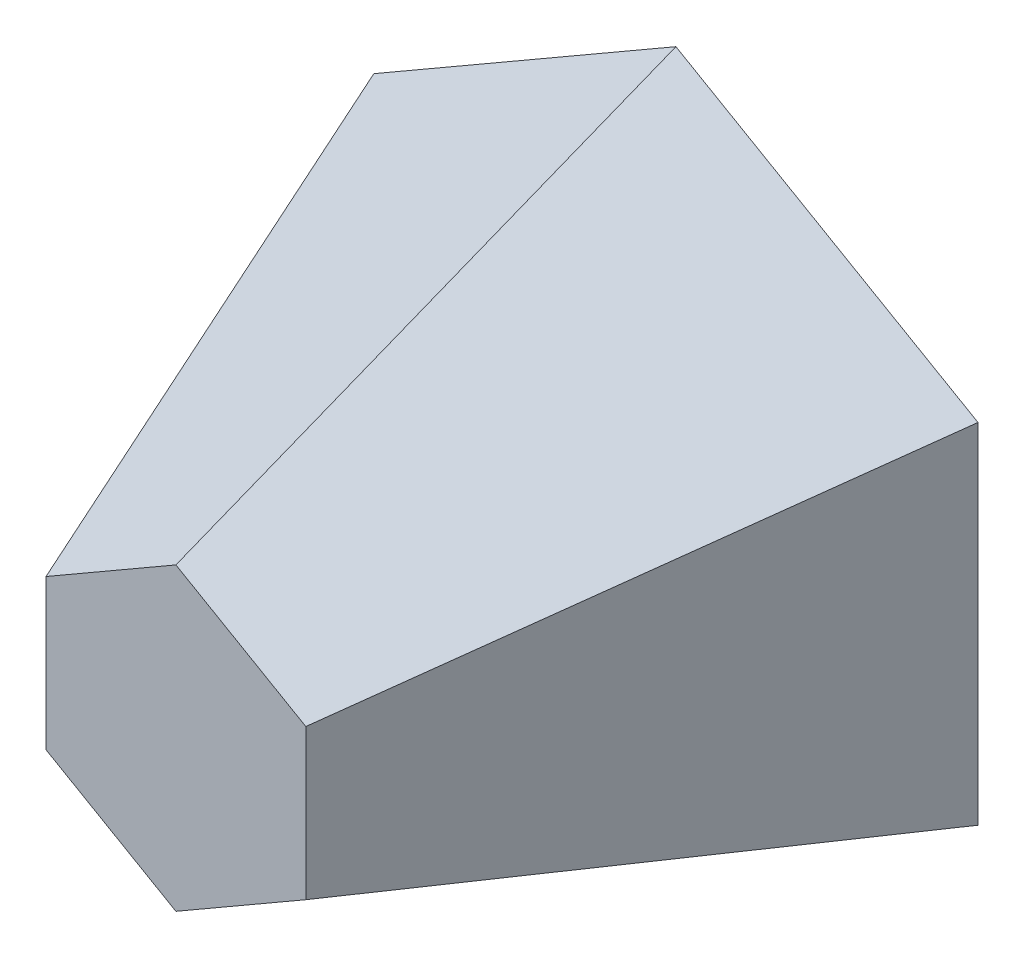
ISO-10303-21;
HEADER;
FILE_DESCRIPTION(('STEP AP214'),'2;1');
FILE_NAME('part.step','',(''),(''),'','','');
FILE_SCHEMA(('AUTOMOTIVE_DESIGN { 1 0 10303 214 1 1 1 1 }'));
ENDSEC;
DATA;
#1=APPLICATION_CONTEXT('core data for automotive mechanical design processes');
#2=APPLICATION_PROTOCOL_DEFINITION('international standard','automotive_design',2000,#1);
#3=PRODUCT_CONTEXT('',#1,'mechanical');
#4=PRODUCT('Part','Part','',(#3));
#5=PRODUCT_RELATED_PRODUCT_CATEGORY('part','',(#4));
#6=PRODUCT_DEFINITION_FORMATION('','',#4);
#7=PRODUCT_DEFINITION_CONTEXT('part definition',#1,'design');
#8=PRODUCT_DEFINITION('design','',#6,#7);
#9=PRODUCT_DEFINITION_SHAPE('','',#8);
#10=(LENGTH_UNIT() NAMED_UNIT(*) SI_UNIT(.MILLI.,.METRE.));
#11=(NAMED_UNIT(*) PLANE_ANGLE_UNIT() SI_UNIT($,.RADIAN.));
#12=(NAMED_UNIT(*) SI_UNIT($,.STERADIAN.) SOLID_ANGLE_UNIT());
#13=UNCERTAINTY_MEASURE_WITH_UNIT(LENGTH_MEASURE(1.E-05),#10,'distance_accuracy_value','');
#14=(GEOMETRIC_REPRESENTATION_CONTEXT(3) GLOBAL_UNCERTAINTY_ASSIGNED_CONTEXT((#13)) GLOBAL_UNIT_ASSIGNED_CONTEXT((#10,
#11,#12)) REPRESENTATION_CONTEXT('',''));
#15=CARTESIAN_POINT('',(0.,0.,0.));
#16=DIRECTION('',(0.,0.,1.));
#17=DIRECTION('',(1.,0.,0.));
#18=AXIS2_PLACEMENT_3D('',#15,#16,#17);
#19=CARTESIAN_POINT('',(64.9519052838329,37.5000000000001,125.));
#20=DIRECTION('',(0.472759287799658,0.818843106219086,0.325568154457157));
#21=DIRECTION('',(-0.866025403784439,0.5,0.));
#22=AXIS2_PLACEMENT_3D('',#19,#20,#21);
#23=PLANE('',#22);
#24=DIRECTION('',(0.866025403784439,-0.5,0.));
#25=VECTOR('',#24,1.);
#26=CARTESIAN_POINT('',(107.992856945041,112.049115083329,-125.));
#27=LINE('',#26,#25);
#28=CARTESIAN_POINT('',(151.033808606249,87.1994100555526,-125.));
#29=VERTEX_POINT('',#28);
#30=CARTESIAN_POINT('',(0.,174.398820111105,-125.));
#31=VERTEX_POINT('',#30);
#32=EDGE_CURVE('E98',#29,#31,#27,.F.);
#33=ORIENTED_EDGE('',*,*,#32,.T.);
#34=DIRECTION('',(0.,0.369463519951551,-0.929245235352331));
#35=VECTOR('',#34,1.);
#36=CARTESIAN_POINT('',(0.,75.,125.));
#37=LINE('',#36,#35);
#38=CARTESIAN_POINT('',(0.,75.,125.));
#39=VERTEX_POINT('',#38);
#40=EDGE_CURVE('E11',#39,#31,#37,.T.);
#41=ORIENTED_EDGE('',*,*,#40,.F.);
#42=DIRECTION('',(-0.866025403784439,0.5,0.));
#43=VECTOR('',#42,1.);
#44=CARTESIAN_POINT('',(64.9519052838329,37.5000000000001,125.));
#45=LINE('',#44,#43);
#46=CARTESIAN_POINT('',(64.9519052838329,37.5000000000001,125.));
#47=VERTEX_POINT('',#46);
#48=EDGE_CURVE('E120',#47,#39,#45,.T.);
#49=ORIENTED_EDGE('',*,*,#48,.F.);
#50=DIRECTION('',(0.319964794049662,0.184731759975776,-0.929245235352331));
#51=VECTOR('',#50,1.);
#52=CARTESIAN_POINT('',(64.9519052838329,37.5000000000001,125.));
#53=LINE('',#52,#51);
#54=EDGE_CURVE('E123',#47,#29,#53,.T.);
#55=ORIENTED_EDGE('',*,*,#54,.T.);
#56=EDGE_LOOP('',(#33,#41,#49,#55));
#57=FACE_BOUND('',#56,.T.);
#58=ADVANCED_FACE('F35',(#57),#23,.T.);
#59=CARTESIAN_POINT('',(0.,75.,125.));
#60=DIRECTION('',(-0.472759287799658,0.818843106219085,0.325568154457157));
#61=DIRECTION('',(-0.866025403784439,-0.5,0.));
#62=AXIS2_PLACEMENT_3D('',#59,#60,#61);
#63=PLANE('',#62);
#64=DIRECTION('',(0.866025403784439,0.5,0.));
#65=VECTOR('',#64,1.);
#66=CARTESIAN_POINT('',(-43.0409516612083,149.549115083329,-125.));
#67=LINE('',#66,#65);
#68=CARTESIAN_POINT('',(-151.033808606249,87.1994100555525,-125.));
#69=VERTEX_POINT('',#68);
#70=EDGE_CURVE('E87',#31,#69,#67,.F.);
#71=ORIENTED_EDGE('',*,*,#70,.T.);
#72=DIRECTION('',(-0.319964794049662,0.184731759975776,-0.929245235352331));
#73=VECTOR('',#72,1.);
#74=CARTESIAN_POINT('',(-64.9519052838329,37.5,125.));
#75=LINE('',#74,#73);
#76=CARTESIAN_POINT('',(-64.9519052838329,37.5,125.));
#77=VERTEX_POINT('',#76);
#78=EDGE_CURVE('E44',#77,#69,#75,.T.);
#79=ORIENTED_EDGE('',*,*,#78,.F.);
#80=DIRECTION('',(-0.866025403784438,-0.5,0.));
#81=VECTOR('',#80,1.);
#82=CARTESIAN_POINT('',(0.,75.,125.));
#83=LINE('',#82,#81);
#84=EDGE_CURVE('E139',#39,#77,#83,.T.);
#85=ORIENTED_EDGE('',*,*,#84,.F.);
#86=ORIENTED_EDGE('',*,*,#40,.T.);
#87=EDGE_LOOP('',(#71,#79,#85,#86));
#88=FACE_BOUND('',#87,.T.);
#89=ADVANCED_FACE('F89',(#88),#63,.T.);
#90=CARTESIAN_POINT('',(-64.9519052838329,37.5,125.));
#91=DIRECTION('',(-0.945518575599317,0.,0.325568154457157));
#92=DIRECTION('',(0.325568154457157,0.,0.945518575599317));
#93=AXIS2_PLACEMENT_3D('',#90,#91,#92);
#94=PLANE('',#93);
#95=DIRECTION('',(0.,1.,0.));
#96=VECTOR('',#95,1.);
#97=CARTESIAN_POINT('',(-151.033808606249,37.5,-125.));
#98=LINE('',#97,#96);
#99=CARTESIAN_POINT('',(-151.033808606249,-87.1994100555525,-125.));
#100=VERTEX_POINT('',#99);
#101=EDGE_CURVE('E39',#69,#100,#98,.F.);
#102=ORIENTED_EDGE('',*,*,#101,.T.);
#103=DIRECTION('',(-0.319964794049662,-0.184731759975776,-0.929245235352331));
#104=VECTOR('',#103,1.);
#105=CARTESIAN_POINT('',(-64.9519052838329,-37.5,125.));
#106=LINE('',#105,#104);
#107=CARTESIAN_POINT('',(-64.9519052838329,-37.5,125.));
#108=VERTEX_POINT('',#107);
#109=EDGE_CURVE('E106',#108,#100,#106,.T.);
#110=ORIENTED_EDGE('',*,*,#109,.F.);
#111=DIRECTION('',(0.,-1.,0.));
#112=VECTOR('',#111,1.);
#113=CARTESIAN_POINT('',(-64.9519052838329,37.5,125.));
#114=LINE('',#113,#112);
#115=EDGE_CURVE('E105',#77,#108,#114,.T.);
#116=ORIENTED_EDGE('',*,*,#115,.F.);
#117=ORIENTED_EDGE('',*,*,#78,.T.);
#118=EDGE_LOOP('',(#102,#110,#116,#117));
#119=FACE_BOUND('',#118,.T.);
#120=ADVANCED_FACE('F101',(#119),#94,.T.);
#121=CARTESIAN_POINT('',(-64.9519052838329,-37.5,125.));
#122=DIRECTION('',(-0.472759287799658,-0.818843106219086,0.325568154457157));
#123=DIRECTION('',(0.866025403784438,-0.5,0.));
#124=AXIS2_PLACEMENT_3D('',#121,#122,#123);
#125=PLANE('',#124);
#126=DIRECTION('',(-0.866025403784438,0.5,0.));
#127=VECTOR('',#126,1.);
#128=CARTESIAN_POINT('',(-107.992856945041,-112.049115083329,-125.));
#129=LINE('',#128,#127);
#130=CARTESIAN_POINT('',(0.,-174.398820111105,-125.));
#131=VERTEX_POINT('',#130);
#132=EDGE_CURVE('E111',#100,#131,#129,.F.);
#133=ORIENTED_EDGE('',*,*,#132,.T.);
#134=DIRECTION('',(0.,-0.369463519951551,-0.929245235352331));
#135=VECTOR('',#134,1.);
#136=CARTESIAN_POINT('',(0.,-75.,125.));
#137=LINE('',#136,#135);
#138=CARTESIAN_POINT('',(0.,-75.,125.));
#139=VERTEX_POINT('',#138);
#140=EDGE_CURVE('E129',#139,#131,#137,.T.);
#141=ORIENTED_EDGE('',*,*,#140,.F.);
#142=DIRECTION('',(0.866025403784439,-0.5,0.));
#143=VECTOR('',#142,1.);
#144=CARTESIAN_POINT('',(-64.9519052838329,-37.5,125.));
#145=LINE('',#144,#143);
#146=EDGE_CURVE('E135',#108,#139,#145,.T.);
#147=ORIENTED_EDGE('',*,*,#146,.F.);
#148=ORIENTED_EDGE('',*,*,#109,.T.);
#149=EDGE_LOOP('',(#133,#141,#147,#148));
#150=FACE_BOUND('',#149,.T.);
#151=ADVANCED_FACE('F228',(#150),#125,.T.);
#152=CARTESIAN_POINT('',(0.,-75.,125.));
#153=DIRECTION('',(0.472759287799659,-0.818843106219085,0.325568154457157));
#154=DIRECTION('',(0.866025403784439,0.5,0.));
#155=AXIS2_PLACEMENT_3D('',#152,#153,#154);
#156=PLANE('',#155);
#157=DIRECTION('',(-0.866025403784439,-0.5,0.));
#158=VECTOR('',#157,1.);
#159=CARTESIAN_POINT('',(43.0409516612083,-149.549115083329,-125.));
#160=LINE('',#159,#158);
#161=CARTESIAN_POINT('',(151.033808606249,-87.1994100555525,-125.));
#162=VERTEX_POINT('',#161);
#163=EDGE_CURVE('E112',#131,#162,#160,.F.);
#164=ORIENTED_EDGE('',*,*,#163,.T.);
#165=DIRECTION('',(0.319964794049662,-0.184731759975776,-0.929245235352331));
#166=VECTOR('',#165,1.);
#167=CARTESIAN_POINT('',(64.9519052838329,-37.5,125.));
#168=LINE('',#167,#166);
#169=CARTESIAN_POINT('',(64.9519052838329,-37.5,125.));
#170=VERTEX_POINT('',#169);
#171=EDGE_CURVE('E126',#170,#162,#168,.T.);
#172=ORIENTED_EDGE('',*,*,#171,.F.);
#173=DIRECTION('',(0.866025403784439,0.5,0.));
#174=VECTOR('',#173,1.);
#175=CARTESIAN_POINT('',(0.,-75.,125.));
#176=LINE('',#175,#174);
#177=EDGE_CURVE('E133',#139,#170,#176,.T.);
#178=ORIENTED_EDGE('',*,*,#177,.F.);
#179=ORIENTED_EDGE('',*,*,#140,.T.);
#180=EDGE_LOOP('',(#164,#172,#178,#179));
#181=FACE_BOUND('',#180,.T.);
#182=ADVANCED_FACE('F37',(#181),#156,.T.);
#183=CARTESIAN_POINT('',(64.9519052838329,-37.5,125.));
#184=DIRECTION('',(0.945518575599317,0.,0.325568154457157));
#185=DIRECTION('',(0.325568154457157,0.,-0.945518575599317));
#186=AXIS2_PLACEMENT_3D('',#183,#184,#185);
#187=PLANE('',#186);
#188=DIRECTION('',(0.,-1.,0.));
#189=VECTOR('',#188,1.);
#190=CARTESIAN_POINT('',(151.033808606249,-37.5,-125.));
#191=LINE('',#190,#189);
#192=EDGE_CURVE('E116',#162,#29,#191,.F.);
#193=ORIENTED_EDGE('',*,*,#192,.T.);
#194=ORIENTED_EDGE('',*,*,#54,.F.);
#195=DIRECTION('',(0.,1.,0.));
#196=VECTOR('',#195,1.);
#197=CARTESIAN_POINT('',(64.9519052838329,-37.5,125.));
#198=LINE('',#197,#196);
#199=EDGE_CURVE('E61',#170,#47,#198,.T.);
#200=ORIENTED_EDGE('',*,*,#199,.F.);
#201=ORIENTED_EDGE('',*,*,#171,.T.);
#202=EDGE_LOOP('',(#193,#194,#200,#201));
#203=FACE_BOUND('',#202,.T.);
#204=ADVANCED_FACE('F232',(#203),#187,.T.);
#205=CARTESIAN_POINT('',(0.,0.,125.));
#206=DIRECTION('',(0.,0.,1.));
#207=DIRECTION('',(1.,0.,0.));
#208=AXIS2_PLACEMENT_3D('',#205,#206,#207);
#209=PLANE('',#208);
#210=ORIENTED_EDGE('',*,*,#48,.T.);
#211=ORIENTED_EDGE('',*,*,#84,.T.);
#212=ORIENTED_EDGE('',*,*,#115,.T.);
#213=ORIENTED_EDGE('',*,*,#146,.T.);
#214=ORIENTED_EDGE('',*,*,#177,.T.);
#215=ORIENTED_EDGE('',*,*,#199,.T.);
#216=EDGE_LOOP('',(#210,#211,#212,#213,#214,#215));
#217=FACE_BOUND('',#216,.T.);
#218=ADVANCED_FACE('F225',(#217),#209,.T.);
#219=CARTESIAN_POINT('',(0.,0.,-125.));
#220=DIRECTION('',(0.,0.,1.));
#221=DIRECTION('',(1.,0.,0.));
#222=AXIS2_PLACEMENT_3D('',#219,#220,#221);
#223=PLANE('',#222);
#224=DIRECTION('',(0.,-1.,0.));
#225=VECTOR('',#224,1.);
#226=CARTESIAN_POINT('',(149.553139652588,-37.5,-125.));
#227=LINE('',#226,#225);
#228=CARTESIAN_POINT('',(149.553139652588,-86.3445454365754,-125.));
#229=VERTEX_POINT('',#228);
#230=CARTESIAN_POINT('',(149.553139652588,86.3445454365755,-125.));
#231=VERTEX_POINT('',#230);
#232=EDGE_CURVE('E154',#229,#231,#227,.F.);
#233=ORIENTED_EDGE('',*,*,#232,.T.);
#234=DIRECTION('',(0.866025403784439,-0.5,0.));
#235=VECTOR('',#234,1.);
#236=CARTESIAN_POINT('',(107.25252246821,110.766818154863,-125.));
#237=LINE('',#236,#235);
#238=CARTESIAN_POINT('',(0.,172.689090873151,-125.));
#239=VERTEX_POINT('',#238);
#240=EDGE_CURVE('E146',#231,#239,#237,.F.);
#241=ORIENTED_EDGE('',*,*,#240,.T.);
#242=DIRECTION('',(0.866025403784439,0.5,0.));
#243=VECTOR('',#242,1.);
#244=CARTESIAN_POINT('',(-42.3006171843776,148.266818154863,-125.));
#245=LINE('',#244,#243);
#246=CARTESIAN_POINT('',(-149.553139652588,86.3445454365754,-125.));
#247=VERTEX_POINT('',#246);
#248=EDGE_CURVE('E143',#239,#247,#245,.F.);
#249=ORIENTED_EDGE('',*,*,#248,.T.);
#250=DIRECTION('',(0.,1.,0.));
#251=VECTOR('',#250,1.);
#252=CARTESIAN_POINT('',(-149.553139652588,37.5,-125.));
#253=LINE('',#252,#251);
#254=CARTESIAN_POINT('',(-149.553139652588,-86.3445454365754,-125.));
#255=VERTEX_POINT('',#254);
#256=EDGE_CURVE('E52',#247,#255,#253,.F.);
#257=ORIENTED_EDGE('',*,*,#256,.T.);
#258=DIRECTION('',(-0.866025403784438,0.5,0.));
#259=VECTOR('',#258,1.);
#260=CARTESIAN_POINT('',(-107.25252246821,-110.766818154863,-125.));
#261=LINE('',#260,#259);
#262=CARTESIAN_POINT('',(0.,-172.689090873151,-125.));
#263=VERTEX_POINT('',#262);
#264=EDGE_CURVE('E148',#255,#263,#261,.F.);
#265=ORIENTED_EDGE('',*,*,#264,.T.);
#266=DIRECTION('',(-0.866025403784439,-0.5,0.));
#267=VECTOR('',#266,1.);
#268=CARTESIAN_POINT('',(42.3006171843776,-148.266818154863,-125.));
#269=LINE('',#268,#267);
#270=EDGE_CURVE('E151',#263,#229,#269,.F.);
#271=ORIENTED_EDGE('',*,*,#270,.T.);
#272=EDGE_LOOP('',(#233,#241,#249,#257,#265,#271));
#273=FACE_BOUND('',#272,.T.);
#274=ORIENTED_EDGE('',*,*,#32,.F.);
#275=ORIENTED_EDGE('',*,*,#192,.F.);
#276=ORIENTED_EDGE('',*,*,#163,.F.);
#277=ORIENTED_EDGE('',*,*,#132,.F.);
#278=ORIENTED_EDGE('',*,*,#101,.F.);
#279=ORIENTED_EDGE('',*,*,#70,.F.);
#280=EDGE_LOOP('',(#274,#275,#276,#277,#278,#279));
#281=FACE_BOUND('',#280,.T.);
#282=ADVANCED_FACE('F109',(#273,#281),#223,.F.);
#283=CARTESIAN_POINT('',(64.2900422809133,36.3536196512933,124.54420458376));
#284=DIRECTION('',(0.472759287799658,0.818843106219086,0.325568154457157));
#285=DIRECTION('',(-0.866025403784439,0.5,0.));
#286=AXIS2_PLACEMENT_3D('',#283,#284,#285);
#287=PLANE('',#286);
#288=ORIENTED_EDGE('',*,*,#240,.F.);
#289=DIRECTION('',(0.319964794049662,0.184731759975776,-0.929245235352331));
#290=VECTOR('',#289,1.);
#291=CARTESIAN_POINT('',(63.6733525175599,36.7618272162192,124.413011970032));
#292=LINE('',#291,#290);
#293=CARTESIAN_POINT('',(63.9532949887771,36.923452077334,123.6));
#294=VERTEX_POINT('',#293);
#295=EDGE_CURVE('E163',#294,#231,#292,.T.);
#296=ORIENTED_EDGE('',*,*,#295,.F.);
#297=DIRECTION('',(0.866025403784439,-0.5,0.));
#298=VECTOR('',#297,1.);
#299=CARTESIAN_POINT('',(64.452600136305,36.6351781160011,123.6));
#300=LINE('',#299,#298);
#301=CARTESIAN_POINT('',(0.,73.846904154668,123.6));
#302=VERTEX_POINT('',#301);
#303=EDGE_CURVE('E157',#294,#302,#300,.F.);
#304=ORIENTED_EDGE('',*,*,#303,.T.);
#305=DIRECTION('',(0.,0.369463519951551,-0.929245235352331));
#306=VECTOR('',#305,1.);
#307=CARTESIAN_POINT('',(0.,73.5236544324383,124.413011970032));
#308=LINE('',#307,#306);
#309=EDGE_CURVE('E121',#302,#239,#308,.T.);
#310=ORIENTED_EDGE('',*,*,#309,.T.);
#311=EDGE_LOOP('',(#288,#296,#304,#310));
#312=FACE_BOUND('',#311,.T.);
#313=ADVANCED_FACE('F195',(#312),#287,.F.);
#314=CARTESIAN_POINT('',(0.661863002919508,73.8536196512933,124.54420458376));
#315=DIRECTION('',(-0.472759287799658,0.818843106219085,0.325568154457157));
#316=DIRECTION('',(-0.866025403784439,-0.5,0.));
#317=AXIS2_PLACEMENT_3D('',#314,#315,#316);
#318=PLANE('',#317);
#319=ORIENTED_EDGE('',*,*,#248,.F.);
#320=ORIENTED_EDGE('',*,*,#309,.F.);
#321=DIRECTION('',(0.866025403784439,0.5,0.));
#322=VECTOR('',#321,1.);
#323=CARTESIAN_POINT('',(0.499305147527891,74.135178116001,123.6));
#324=LINE('',#323,#322);
#325=CARTESIAN_POINT('',(-63.9532949887771,36.923452077334,123.6));
#326=VERTEX_POINT('',#325);
#327=EDGE_CURVE('E180',#302,#326,#324,.F.);
#328=ORIENTED_EDGE('',*,*,#327,.T.);
#329=DIRECTION('',(-0.319964794049662,0.184731759975776,-0.929245235352331));
#330=VECTOR('',#329,1.);
#331=CARTESIAN_POINT('',(-63.6733525175599,36.7618272162191,124.413011970032));
#332=LINE('',#331,#330);
#333=EDGE_CURVE('E182',#326,#247,#332,.T.);
#334=ORIENTED_EDGE('',*,*,#333,.T.);
#335=EDGE_LOOP('',(#319,#320,#328,#334));
#336=FACE_BOUND('',#335,.T.);
#337=ADVANCED_FACE('F276',(#336),#318,.F.);
#338=CARTESIAN_POINT('',(-63.6281792779939,37.5,124.54420458376));
#339=DIRECTION('',(-0.945518575599317,0.,0.325568154457157));
#340=DIRECTION('',(0.325568154457157,0.,0.945518575599317));
#341=AXIS2_PLACEMENT_3D('',#338,#339,#340);
#342=PLANE('',#341);
#343=ORIENTED_EDGE('',*,*,#256,.F.);
#344=ORIENTED_EDGE('',*,*,#333,.F.);
#345=DIRECTION('',(0.,1.,0.));
#346=VECTOR('',#345,1.);
#347=CARTESIAN_POINT('',(-63.9532949887771,37.5,123.6));
#348=LINE('',#347,#346);
#349=CARTESIAN_POINT('',(-63.9532949887771,-36.923452077334,123.6));
#350=VERTEX_POINT('',#349);
#351=EDGE_CURVE('E174',#326,#350,#348,.F.);
#352=ORIENTED_EDGE('',*,*,#351,.T.);
#353=DIRECTION('',(-0.319964794049662,-0.184731759975776,-0.929245235352331));
#354=VECTOR('',#353,1.);
#355=CARTESIAN_POINT('',(-63.6733525175599,-36.7618272162191,124.413011970032));
#356=LINE('',#355,#354);
#357=EDGE_CURVE('E177',#350,#255,#356,.T.);
#358=ORIENTED_EDGE('',*,*,#357,.T.);
#359=EDGE_LOOP('',(#343,#344,#352,#358));
#360=FACE_BOUND('',#359,.T.);
#361=ADVANCED_FACE('F272',(#360),#342,.F.);
#362=CARTESIAN_POINT('',(-64.2900422809134,-36.3536196512933,124.54420458376));
#363=DIRECTION('',(-0.472759287799658,-0.818843106219086,0.325568154457157));
#364=DIRECTION('',(0.866025403784438,-0.5,0.));
#365=AXIS2_PLACEMENT_3D('',#362,#363,#364);
#366=PLANE('',#365);
#367=ORIENTED_EDGE('',*,*,#264,.F.);
#368=ORIENTED_EDGE('',*,*,#357,.F.);
#369=DIRECTION('',(-0.866025403784438,0.5,0.));
#370=VECTOR('',#369,1.);
#371=CARTESIAN_POINT('',(-64.452600136305,-36.635178116001,123.6));
#372=LINE('',#371,#370);
#373=CARTESIAN_POINT('',(0.,-73.846904154668,123.6));
#374=VERTEX_POINT('',#373);
#375=EDGE_CURVE('E167',#350,#374,#372,.F.);
#376=ORIENTED_EDGE('',*,*,#375,.T.);
#377=DIRECTION('',(0.,-0.369463519951551,-0.929245235352331));
#378=VECTOR('',#377,1.);
#379=CARTESIAN_POINT('',(0.,-73.5236544324383,124.413011970032));
#380=LINE('',#379,#378);
#381=EDGE_CURVE('E171',#374,#263,#380,.T.);
#382=ORIENTED_EDGE('',*,*,#381,.T.);
#383=EDGE_LOOP('',(#367,#368,#376,#382));
#384=FACE_BOUND('',#383,.T.);
#385=ADVANCED_FACE('F269',(#384),#366,.F.);
#386=CARTESIAN_POINT('',(-0.661863002919492,-73.8536196512933,124.54420458376));
#387=DIRECTION('',(0.472759287799659,-0.818843106219085,0.325568154457157));
#388=DIRECTION('',(0.866025403784439,0.5,0.));
#389=AXIS2_PLACEMENT_3D('',#386,#387,#388);
#390=PLANE('',#389);
#391=ORIENTED_EDGE('',*,*,#270,.F.);
#392=ORIENTED_EDGE('',*,*,#381,.F.);
#393=DIRECTION('',(-0.866025403784439,-0.5,0.));
#394=VECTOR('',#393,1.);
#395=CARTESIAN_POINT('',(-0.499305147527874,-74.135178116001,123.6));
#396=LINE('',#395,#394);
#397=CARTESIAN_POINT('',(63.9532949887771,-36.923452077334,123.6));
#398=VERTEX_POINT('',#397);
#399=EDGE_CURVE('E164',#374,#398,#396,.F.);
#400=ORIENTED_EDGE('',*,*,#399,.T.);
#401=DIRECTION('',(0.319964794049662,-0.184731759975776,-0.929245235352331));
#402=VECTOR('',#401,1.);
#403=CARTESIAN_POINT('',(63.6733525175599,-36.7618272162192,124.413011970032));
#404=LINE('',#403,#402);
#405=EDGE_CURVE('E168',#398,#229,#404,.T.);
#406=ORIENTED_EDGE('',*,*,#405,.T.);
#407=EDGE_LOOP('',(#391,#392,#400,#406));
#408=FACE_BOUND('',#407,.T.);
#409=ADVANCED_FACE('F266',(#408),#390,.F.);
#410=CARTESIAN_POINT('',(63.6281792779938,-37.5,124.54420458376));
#411=DIRECTION('',(0.945518575599317,0.,0.325568154457157));
#412=DIRECTION('',(0.325568154457157,0.,-0.945518575599317));
#413=AXIS2_PLACEMENT_3D('',#410,#411,#412);
#414=PLANE('',#413);
#415=ORIENTED_EDGE('',*,*,#232,.F.);
#416=ORIENTED_EDGE('',*,*,#405,.F.);
#417=DIRECTION('',(0.,-1.,0.));
#418=VECTOR('',#417,1.);
#419=CARTESIAN_POINT('',(63.9532949887771,-37.5,123.6));
#420=LINE('',#419,#418);
#421=EDGE_CURVE('E160',#398,#294,#420,.F.);
#422=ORIENTED_EDGE('',*,*,#421,.T.);
#423=ORIENTED_EDGE('',*,*,#295,.T.);
#424=EDGE_LOOP('',(#415,#416,#422,#423));
#425=FACE_BOUND('',#424,.T.);
#426=ADVANCED_FACE('F211',(#425),#414,.F.);
#427=CARTESIAN_POINT('',(0.,0.,123.6));
#428=DIRECTION('',(0.,0.,1.));
#429=DIRECTION('',(1.,0.,0.));
#430=AXIS2_PLACEMENT_3D('',#427,#428,#429);
#431=PLANE('',#430);
#432=ORIENTED_EDGE('',*,*,#303,.F.);
#433=ORIENTED_EDGE('',*,*,#421,.F.);
#434=ORIENTED_EDGE('',*,*,#399,.F.);
#435=ORIENTED_EDGE('',*,*,#375,.F.);
#436=ORIENTED_EDGE('',*,*,#351,.F.);
#437=ORIENTED_EDGE('',*,*,#327,.F.);
#438=EDGE_LOOP('',(#432,#433,#434,#435,#436,#437));
#439=FACE_BOUND('',#438,.T.);
#440=ADVANCED_FACE('F260',(#439),#431,.F.);
#441=CLOSED_SHELL('',(#58,#89,#120,#151,#182,#204,#218,#282,#313,#337,#361,#385,#409,#426,#440));
#442=MANIFOLD_SOLID_BREP('B2',#441);
#443=ADVANCED_BREP_SHAPE_REPRESENTATION('',(#18,#442),#14);
#444=SHAPE_DEFINITION_REPRESENTATION(#9,#443);
ENDSEC;
END-ISO-10303-21;
